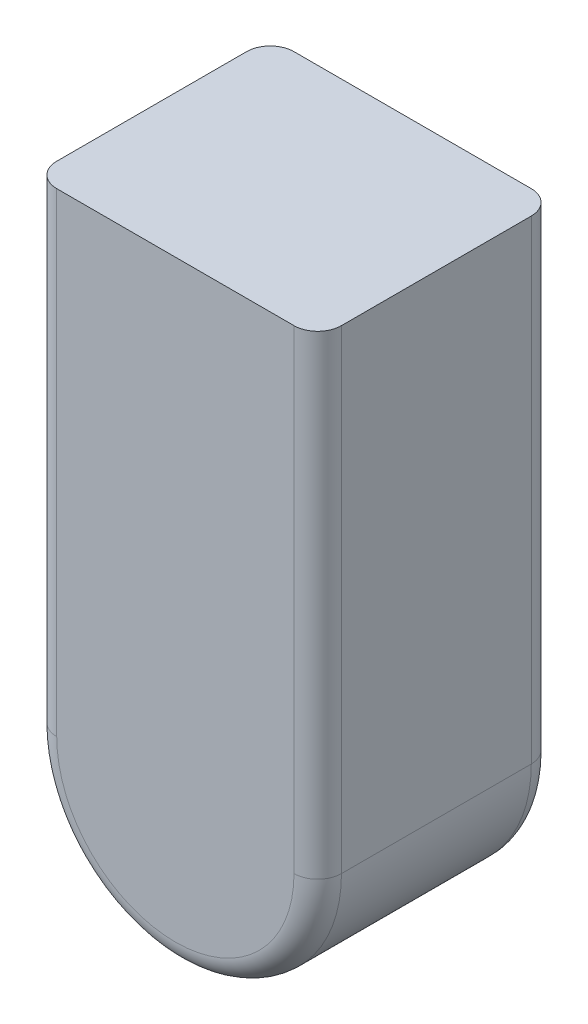
ISO-10303-21;
HEADER;
FILE_DESCRIPTION(('STEP AP214'),'2;1');
FILE_NAME('part.step','',(''),(''),'','','');
FILE_SCHEMA(('AUTOMOTIVE_DESIGN { 1 0 10303 214 1 1 1 1 }'));
ENDSEC;
DATA;
#1=APPLICATION_CONTEXT('core data for automotive mechanical design processes');
#2=APPLICATION_PROTOCOL_DEFINITION('international standard','automotive_design',2000,#1);
#3=PRODUCT_CONTEXT('',#1,'mechanical');
#4=PRODUCT('Part','Part','',(#3));
#5=PRODUCT_RELATED_PRODUCT_CATEGORY('part','',(#4));
#6=PRODUCT_DEFINITION_FORMATION('','',#4);
#7=PRODUCT_DEFINITION_CONTEXT('part definition',#1,'design');
#8=PRODUCT_DEFINITION('design','',#6,#7);
#9=PRODUCT_DEFINITION_SHAPE('','',#8);
#10=(LENGTH_UNIT() NAMED_UNIT(*) SI_UNIT(.MILLI.,.METRE.));
#11=(NAMED_UNIT(*) PLANE_ANGLE_UNIT() SI_UNIT($,.RADIAN.));
#12=(NAMED_UNIT(*) SI_UNIT($,.STERADIAN.) SOLID_ANGLE_UNIT());
#13=UNCERTAINTY_MEASURE_WITH_UNIT(LENGTH_MEASURE(1.E-05),#10,'distance_accuracy_value','');
#14=(GEOMETRIC_REPRESENTATION_CONTEXT(3) GLOBAL_UNCERTAINTY_ASSIGNED_CONTEXT((#13)) GLOBAL_UNIT_ASSIGNED_CONTEXT((#10,
#11,#12)) REPRESENTATION_CONTEXT('',''));
#15=CARTESIAN_POINT('',(0.,0.,0.));
#16=DIRECTION('',(0.,0.,1.));
#17=DIRECTION('',(1.,0.,0.));
#18=AXIS2_PLACEMENT_3D('',#15,#16,#17);
#19=CARTESIAN_POINT('',(0.,0.,5.));
#20=DIRECTION('',(0.,0.,-1.));
#21=DIRECTION('',(-1.,0.,0.));
#22=AXIS2_PLACEMENT_3D('',#19,#20,#21);
#23=CYLINDRICAL_SURFACE('',#22,6.);
#24=DIRECTION('',(0.,0.,-1.));
#25=VECTOR('',#24,1.);
#26=CARTESIAN_POINT('',(6.,0.,5.));
#27=LINE('',#26,#25);
#28=CARTESIAN_POINT('',(6.,0.,4.));
#29=VERTEX_POINT('',#28);
#30=CARTESIAN_POINT('',(6.,0.,-4.));
#31=VERTEX_POINT('',#30);
#32=EDGE_CURVE('E121',#29,#31,#27,.T.);
#33=ORIENTED_EDGE('',*,*,#32,.F.);
#34=CARTESIAN_POINT('',(0.,0.,4.));
#35=DIRECTION('',(0.,0.,1.));
#36=DIRECTION('',(1.,0.,0.));
#37=AXIS2_PLACEMENT_3D('',#34,#35,#36);
#38=CIRCLE('',#37,6.);
#39=CARTESIAN_POINT('',(-6.,0.,4.));
#40=VERTEX_POINT('',#39);
#41=EDGE_CURVE('E187',#29,#40,#38,.F.);
#42=ORIENTED_EDGE('',*,*,#41,.T.);
#43=DIRECTION('',(0.,0.,-1.));
#44=VECTOR('',#43,1.);
#45=CARTESIAN_POINT('',(-6.,0.,5.));
#46=LINE('',#45,#44);
#47=CARTESIAN_POINT('',(-6.,0.,-4.));
#48=VERTEX_POINT('',#47);
#49=EDGE_CURVE('E128',#40,#48,#46,.T.);
#50=ORIENTED_EDGE('',*,*,#49,.T.);
#51=CARTESIAN_POINT('',(0.,0.,-4.));
#52=DIRECTION('',(0.,0.,1.));
#53=DIRECTION('',(1.,0.,0.));
#54=AXIS2_PLACEMENT_3D('',#51,#52,#53);
#55=CIRCLE('',#54,6.);
#56=EDGE_CURVE('E169',#48,#31,#55,.T.);
#57=ORIENTED_EDGE('',*,*,#56,.T.);
#58=EDGE_LOOP('',(#33,#42,#50,#57));
#59=FACE_BOUND('',#58,.T.);
#60=ADVANCED_FACE('F43',(#59),#23,.T.);
#61=CARTESIAN_POINT('',(6.,20.,5.));
#62=DIRECTION('',(-1.,0.,0.));
#63=DIRECTION('',(0.,0.,1.));
#64=AXIS2_PLACEMENT_3D('',#61,#62,#63);
#65=PLANE('',#64);
#66=ORIENTED_EDGE('',*,*,#32,.T.);
#67=DIRECTION('',(0.,1.,0.));
#68=VECTOR('',#67,1.);
#69=CARTESIAN_POINT('',(6.,20.,-4.));
#70=LINE('',#69,#68);
#71=CARTESIAN_POINT('',(6.,20.,-4.));
#72=VERTEX_POINT('',#71);
#73=EDGE_CURVE('E11',#31,#72,#70,.T.);
#74=ORIENTED_EDGE('',*,*,#73,.T.);
#75=DIRECTION('',(0.,0.,-1.));
#76=VECTOR('',#75,1.);
#77=CARTESIAN_POINT('',(6.,20.,5.));
#78=LINE('',#77,#76);
#79=CARTESIAN_POINT('',(6.,20.,4.));
#80=VERTEX_POINT('',#79);
#81=EDGE_CURVE('E199',#80,#72,#78,.T.);
#82=ORIENTED_EDGE('',*,*,#81,.F.);
#83=DIRECTION('',(0.,1.,0.));
#84=VECTOR('',#83,1.);
#85=CARTESIAN_POINT('',(6.,0.,4.));
#86=LINE('',#85,#84);
#87=EDGE_CURVE('E53',#80,#29,#86,.F.);
#88=ORIENTED_EDGE('',*,*,#87,.T.);
#89=EDGE_LOOP('',(#66,#74,#82,#88));
#90=FACE_BOUND('',#89,.T.);
#91=ADVANCED_FACE('F219',(#90),#65,.F.);
#92=CARTESIAN_POINT('',(-6.,20.,5.));
#93=DIRECTION('',(0.,-1.,0.));
#94=DIRECTION('',(0.,0.,-1.));
#95=AXIS2_PLACEMENT_3D('',#92,#93,#94);
#96=PLANE('',#95);
#97=DIRECTION('',(0.,0.,-1.));
#98=VECTOR('',#97,1.);
#99=CARTESIAN_POINT('',(-6.,20.,5.));
#100=LINE('',#99,#98);
#101=CARTESIAN_POINT('',(-6.,20.,4.));
#102=VERTEX_POINT('',#101);
#103=CARTESIAN_POINT('',(-6.,20.,-4.));
#104=VERTEX_POINT('',#103);
#105=EDGE_CURVE('E202',#102,#104,#100,.T.);
#106=ORIENTED_EDGE('',*,*,#105,.F.);
#107=CARTESIAN_POINT('',(-5.,20.,4.));
#108=DIRECTION('',(0.,-1.,0.));
#109=DIRECTION('',(0.,0.,-1.));
#110=AXIS2_PLACEMENT_3D('',#107,#108,#109);
#111=CIRCLE('',#110,1.);
#112=CARTESIAN_POINT('',(-5.,20.,5.));
#113=VERTEX_POINT('',#112);
#114=EDGE_CURVE('E126',#102,#113,#111,.F.);
#115=ORIENTED_EDGE('',*,*,#114,.T.);
#116=DIRECTION('',(-1.,0.,0.));
#117=VECTOR('',#116,1.);
#118=CARTESIAN_POINT('',(-6.,20.,5.));
#119=LINE('',#118,#117);
#120=CARTESIAN_POINT('',(5.,20.,5.));
#121=VERTEX_POINT('',#120);
#122=EDGE_CURVE('E114',#121,#113,#119,.T.);
#123=ORIENTED_EDGE('',*,*,#122,.F.);
#124=CARTESIAN_POINT('',(5.,20.,4.));
#125=DIRECTION('',(0.,-1.,0.));
#126=DIRECTION('',(0.,0.,-1.));
#127=AXIS2_PLACEMENT_3D('',#124,#125,#126);
#128=CIRCLE('',#127,1.);
#129=EDGE_CURVE('E66',#121,#80,#128,.F.);
#130=ORIENTED_EDGE('',*,*,#129,.T.);
#131=ORIENTED_EDGE('',*,*,#81,.T.);
#132=CARTESIAN_POINT('',(5.,20.,-4.));
#133=DIRECTION('',(0.,-1.,0.));
#134=DIRECTION('',(0.,0.,-1.));
#135=AXIS2_PLACEMENT_3D('',#132,#133,#134);
#136=CIRCLE('',#135,1.);
#137=CARTESIAN_POINT('',(5.,20.,-5.));
#138=VERTEX_POINT('',#137);
#139=EDGE_CURVE('E134',#72,#138,#136,.F.);
#140=ORIENTED_EDGE('',*,*,#139,.T.);
#141=DIRECTION('',(-1.,0.,0.));
#142=VECTOR('',#141,1.);
#143=CARTESIAN_POINT('',(-6.,20.,-5.));
#144=LINE('',#143,#142);
#145=CARTESIAN_POINT('',(-5.,20.,-5.));
#146=VERTEX_POINT('',#145);
#147=EDGE_CURVE('E129',#138,#146,#144,.T.);
#148=ORIENTED_EDGE('',*,*,#147,.T.);
#149=CARTESIAN_POINT('',(-5.,20.,-4.));
#150=DIRECTION('',(0.,-1.,0.));
#151=DIRECTION('',(0.,0.,-1.));
#152=AXIS2_PLACEMENT_3D('',#149,#150,#151);
#153=CIRCLE('',#152,1.);
#154=EDGE_CURVE('E139',#146,#104,#153,.F.);
#155=ORIENTED_EDGE('',*,*,#154,.T.);
#156=EDGE_LOOP('',(#106,#115,#123,#130,#131,#140,#148,#155));
#157=FACE_BOUND('',#156,.T.);
#158=ADVANCED_FACE('F124',(#157),#96,.F.);
#159=CARTESIAN_POINT('',(-6.,0.,5.));
#160=DIRECTION('',(1.,0.,0.));
#161=DIRECTION('',(0.,0.,-1.));
#162=AXIS2_PLACEMENT_3D('',#159,#160,#161);
#163=PLANE('',#162);
#164=ORIENTED_EDGE('',*,*,#49,.F.);
#165=DIRECTION('',(0.,-1.,0.));
#166=VECTOR('',#165,1.);
#167=CARTESIAN_POINT('',(-6.,20.,4.));
#168=LINE('',#167,#166);
#169=EDGE_CURVE('E135',#40,#102,#168,.F.);
#170=ORIENTED_EDGE('',*,*,#169,.T.);
#171=ORIENTED_EDGE('',*,*,#105,.T.);
#172=DIRECTION('',(0.,-1.,0.));
#173=VECTOR('',#172,1.);
#174=CARTESIAN_POINT('',(-6.,0.,-4.));
#175=LINE('',#174,#173);
#176=EDGE_CURVE('E141',#104,#48,#175,.T.);
#177=ORIENTED_EDGE('',*,*,#176,.T.);
#178=EDGE_LOOP('',(#164,#170,#171,#177));
#179=FACE_BOUND('',#178,.T.);
#180=ADVANCED_FACE('F226',(#179),#163,.F.);
#181=CARTESIAN_POINT('',(0.,0.,5.));
#182=DIRECTION('',(0.,0.,1.));
#183=DIRECTION('',(1.,0.,0.));
#184=AXIS2_PLACEMENT_3D('',#181,#182,#183);
#185=PLANE('',#184);
#186=ORIENTED_EDGE('',*,*,#122,.T.);
#187=DIRECTION('',(0.,-1.,0.));
#188=VECTOR('',#187,1.);
#189=CARTESIAN_POINT('',(-5.,0.,5.));
#190=LINE('',#189,#188);
#191=CARTESIAN_POINT('',(-5.,0.,5.));
#192=VERTEX_POINT('',#191);
#193=EDGE_CURVE('E192',#113,#192,#190,.T.);
#194=ORIENTED_EDGE('',*,*,#193,.T.);
#195=CARTESIAN_POINT('',(0.,0.,5.));
#196=DIRECTION('',(0.,0.,1.));
#197=DIRECTION('',(1.,0.,0.));
#198=AXIS2_PLACEMENT_3D('',#195,#196,#197);
#199=CIRCLE('',#198,5.);
#200=CARTESIAN_POINT('',(5.,0.,5.));
#201=VERTEX_POINT('',#200);
#202=EDGE_CURVE('E117',#192,#201,#199,.T.);
#203=ORIENTED_EDGE('',*,*,#202,.T.);
#204=DIRECTION('',(0.,1.,0.));
#205=VECTOR('',#204,1.);
#206=CARTESIAN_POINT('',(5.,20.,5.));
#207=LINE('',#206,#205);
#208=EDGE_CURVE('E112',#201,#121,#207,.T.);
#209=ORIENTED_EDGE('',*,*,#208,.T.);
#210=EDGE_LOOP('',(#186,#194,#203,#209));
#211=FACE_BOUND('',#210,.T.);
#212=ADVANCED_FACE('F113',(#211),#185,.T.);
#213=CARTESIAN_POINT('',(0.,0.,-5.));
#214=DIRECTION('',(0.,0.,1.));
#215=DIRECTION('',(1.,0.,0.));
#216=AXIS2_PLACEMENT_3D('',#213,#214,#215);
#217=PLANE('',#216);
#218=CARTESIAN_POINT('',(0.,0.,-5.));
#219=DIRECTION('',(0.,0.,1.));
#220=DIRECTION('',(1.,0.,0.));
#221=AXIS2_PLACEMENT_3D('',#218,#219,#220);
#222=CIRCLE('',#221,5.);
#223=CARTESIAN_POINT('',(5.,0.,-5.));
#224=VERTEX_POINT('',#223);
#225=CARTESIAN_POINT('',(-5.,0.,-5.));
#226=VERTEX_POINT('',#225);
#227=EDGE_CURVE('E167',#224,#226,#222,.F.);
#228=ORIENTED_EDGE('',*,*,#227,.T.);
#229=DIRECTION('',(0.,-1.,0.));
#230=VECTOR('',#229,1.);
#231=CARTESIAN_POINT('',(-5.,0.,-5.));
#232=LINE('',#231,#230);
#233=EDGE_CURVE('E174',#226,#146,#232,.F.);
#234=ORIENTED_EDGE('',*,*,#233,.T.);
#235=ORIENTED_EDGE('',*,*,#147,.F.);
#236=DIRECTION('',(0.,1.,0.));
#237=VECTOR('',#236,1.);
#238=CARTESIAN_POINT('',(5.,0.,-5.));
#239=LINE('',#238,#237);
#240=EDGE_CURVE('E182',#138,#224,#239,.F.);
#241=ORIENTED_EDGE('',*,*,#240,.T.);
#242=EDGE_LOOP('',(#228,#234,#235,#241));
#243=FACE_BOUND('',#242,.T.);
#244=ADVANCED_FACE('F212',(#243),#217,.F.);
#245=CARTESIAN_POINT('',(-5.,0.,4.));
#246=DIRECTION('',(0.,1.,0.));
#247=DIRECTION('',(0.,0.,1.));
#248=AXIS2_PLACEMENT_3D('',#245,#246,#247);
#249=CYLINDRICAL_SURFACE('',#248,1.);
#250=ORIENTED_EDGE('',*,*,#114,.F.);
#251=ORIENTED_EDGE('',*,*,#169,.F.);
#252=CARTESIAN_POINT('',(-5.,0.,4.));
#253=DIRECTION('',(0.,-1.,0.));
#254=DIRECTION('',(0.,0.,-1.));
#255=AXIS2_PLACEMENT_3D('',#252,#253,#254);
#256=CIRCLE('',#255,1.);
#257=EDGE_CURVE('E154',#192,#40,#256,.T.);
#258=ORIENTED_EDGE('',*,*,#257,.F.);
#259=ORIENTED_EDGE('',*,*,#193,.F.);
#260=EDGE_LOOP('',(#250,#251,#258,#259));
#261=FACE_BOUND('',#260,.T.);
#262=ADVANCED_FACE('F237',(#261),#249,.T.);
#263=CARTESIAN_POINT('',(5.,0.,4.));
#264=DIRECTION('',(0.,-1.,0.));
#265=DIRECTION('',(0.,0.,-1.));
#266=AXIS2_PLACEMENT_3D('',#263,#264,#265);
#267=CYLINDRICAL_SURFACE('',#266,1.);
#268=ORIENTED_EDGE('',*,*,#129,.F.);
#269=ORIENTED_EDGE('',*,*,#208,.F.);
#270=CARTESIAN_POINT('',(5.,0.,4.));
#271=DIRECTION('',(0.,-1.,0.));
#272=DIRECTION('',(0.,0.,-1.));
#273=AXIS2_PLACEMENT_3D('',#270,#271,#272);
#274=CIRCLE('',#273,1.);
#275=EDGE_CURVE('E151',#29,#201,#274,.T.);
#276=ORIENTED_EDGE('',*,*,#275,.F.);
#277=ORIENTED_EDGE('',*,*,#87,.F.);
#278=EDGE_LOOP('',(#268,#269,#276,#277));
#279=FACE_BOUND('',#278,.T.);
#280=ADVANCED_FACE('F132',(#279),#267,.T.);
#281=CARTESIAN_POINT('',(0.,0.,4.));
#282=DIRECTION('',(0.,0.,1.));
#283=DIRECTION('',(1.,0.,0.));
#284=AXIS2_PLACEMENT_3D('',#281,#282,#283);
#285=TOROIDAL_SURFACE('',#284,5.,1.);
#286=ORIENTED_EDGE('',*,*,#257,.T.);
#287=ORIENTED_EDGE('',*,*,#41,.F.);
#288=ORIENTED_EDGE('',*,*,#275,.T.);
#289=ORIENTED_EDGE('',*,*,#202,.F.);
#290=EDGE_LOOP('',(#286,#287,#288,#289));
#291=FACE_BOUND('',#290,.T.);
#292=ADVANCED_FACE('F231',(#291),#285,.T.);
#293=CARTESIAN_POINT('',(-5.,0.,-4.));
#294=DIRECTION('',(0.,-1.,0.));
#295=DIRECTION('',(0.,0.,-1.));
#296=AXIS2_PLACEMENT_3D('',#293,#294,#295);
#297=CYLINDRICAL_SURFACE('',#296,1.);
#298=ORIENTED_EDGE('',*,*,#154,.F.);
#299=ORIENTED_EDGE('',*,*,#233,.F.);
#300=CARTESIAN_POINT('',(-5.,0.,-4.));
#301=DIRECTION('',(0.,-1.,0.));
#302=DIRECTION('',(0.,0.,-1.));
#303=AXIS2_PLACEMENT_3D('',#300,#301,#302);
#304=CIRCLE('',#303,1.);
#305=EDGE_CURVE('E47',#48,#226,#304,.T.);
#306=ORIENTED_EDGE('',*,*,#305,.F.);
#307=ORIENTED_EDGE('',*,*,#176,.F.);
#308=EDGE_LOOP('',(#298,#299,#306,#307));
#309=FACE_BOUND('',#308,.T.);
#310=ADVANCED_FACE('F45',(#309),#297,.T.);
#311=CARTESIAN_POINT('',(5.,20.,-4.));
#312=DIRECTION('',(0.,1.,0.));
#313=DIRECTION('',(0.,0.,1.));
#314=AXIS2_PLACEMENT_3D('',#311,#312,#313);
#315=CYLINDRICAL_SURFACE('',#314,1.);
#316=ORIENTED_EDGE('',*,*,#139,.F.);
#317=ORIENTED_EDGE('',*,*,#73,.F.);
#318=CARTESIAN_POINT('',(5.,0.,-4.));
#319=DIRECTION('',(0.,-1.,0.));
#320=DIRECTION('',(0.,0.,-1.));
#321=AXIS2_PLACEMENT_3D('',#318,#319,#320);
#322=CIRCLE('',#321,1.);
#323=EDGE_CURVE('E157',#224,#31,#322,.T.);
#324=ORIENTED_EDGE('',*,*,#323,.F.);
#325=ORIENTED_EDGE('',*,*,#240,.F.);
#326=EDGE_LOOP('',(#316,#317,#324,#325));
#327=FACE_BOUND('',#326,.T.);
#328=ADVANCED_FACE('F214',(#327),#315,.T.);
#329=CARTESIAN_POINT('',(0.,0.,-4.));
#330=DIRECTION('',(0.,0.,1.));
#331=DIRECTION('',(1.,0.,0.));
#332=AXIS2_PLACEMENT_3D('',#329,#330,#331);
#333=TOROIDAL_SURFACE('',#332,5.,1.);
#334=ORIENTED_EDGE('',*,*,#305,.T.);
#335=ORIENTED_EDGE('',*,*,#227,.F.);
#336=ORIENTED_EDGE('',*,*,#323,.T.);
#337=ORIENTED_EDGE('',*,*,#56,.F.);
#338=EDGE_LOOP('',(#334,#335,#336,#337));
#339=FACE_BOUND('',#338,.T.);
#340=ADVANCED_FACE('F166',(#339),#333,.T.);
#341=CLOSED_SHELL('',(#60,#91,#158,#180,#212,#244,#262,#280,#292,#310,#328,#340));
#342=MANIFOLD_SOLID_BREP('B2',#341);
#343=ADVANCED_BREP_SHAPE_REPRESENTATION('',(#18,#342),#14);
#344=SHAPE_DEFINITION_REPRESENTATION(#9,#343);
ENDSEC;
END-ISO-10303-21;
